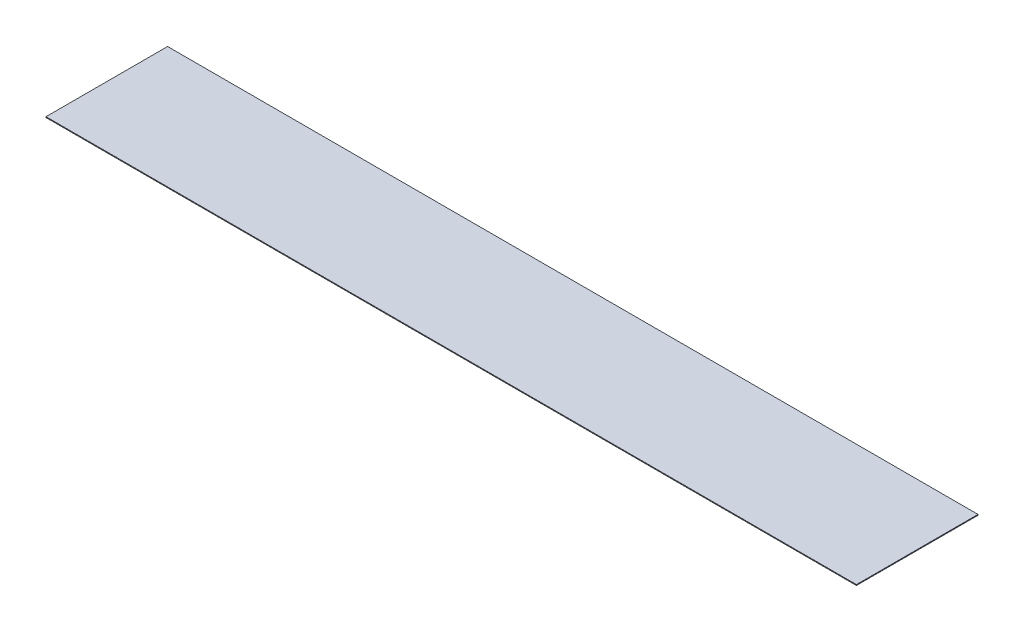
ISO-10303-21;
HEADER;
FILE_DESCRIPTION(('STEP AP214'),'2;1');
FILE_NAME('part.step','',(''),(''),'','','');
FILE_SCHEMA(('AUTOMOTIVE_DESIGN { 1 0 10303 214 1 1 1 1 }'));
ENDSEC;
DATA;
#1=APPLICATION_CONTEXT('core data for automotive mechanical design processes');
#2=APPLICATION_PROTOCOL_DEFINITION('international standard','automotive_design',2000,#1);
#3=PRODUCT_CONTEXT('',#1,'mechanical');
#4=PRODUCT('Part','Part','',(#3));
#5=PRODUCT_RELATED_PRODUCT_CATEGORY('part','',(#4));
#6=PRODUCT_DEFINITION_FORMATION('','',#4);
#7=PRODUCT_DEFINITION_CONTEXT('part definition',#1,'design');
#8=PRODUCT_DEFINITION('design','',#6,#7);
#9=PRODUCT_DEFINITION_SHAPE('','',#8);
#10=(LENGTH_UNIT() NAMED_UNIT(*) SI_UNIT(.MILLI.,.METRE.));
#11=(NAMED_UNIT(*) PLANE_ANGLE_UNIT() SI_UNIT($,.RADIAN.));
#12=(NAMED_UNIT(*) SI_UNIT($,.STERADIAN.) SOLID_ANGLE_UNIT());
#13=UNCERTAINTY_MEASURE_WITH_UNIT(LENGTH_MEASURE(1.E-05),#10,'distance_accuracy_value','');
#14=(GEOMETRIC_REPRESENTATION_CONTEXT(3) GLOBAL_UNCERTAINTY_ASSIGNED_CONTEXT((#13)) GLOBAL_UNIT_ASSIGNED_CONTEXT((#10,
#11,#12)) REPRESENTATION_CONTEXT('',''));
#15=CARTESIAN_POINT('',(0.,0.,0.));
#16=DIRECTION('',(0.,0.,1.));
#17=DIRECTION('',(1.,0.,0.));
#18=AXIS2_PLACEMENT_3D('',#15,#16,#17);
#19=CARTESIAN_POINT('',(500.,1.,75.));
#20=DIRECTION('',(-1.,0.,0.));
#21=DIRECTION('',(0.,0.,1.));
#22=AXIS2_PLACEMENT_3D('',#19,#20,#21);
#23=PLANE('',#22);
#24=DIRECTION('',(0.,0.,-1.));
#25=VECTOR('',#24,1.);
#26=CARTESIAN_POINT('',(500.,0.,75.));
#27=LINE('',#26,#25);
#28=CARTESIAN_POINT('',(500.,0.,75.));
#29=VERTEX_POINT('',#28);
#30=CARTESIAN_POINT('',(500.,0.,-75.));
#31=VERTEX_POINT('',#30);
#32=EDGE_CURVE('E107',#29,#31,#27,.T.);
#33=ORIENTED_EDGE('',*,*,#32,.T.);
#34=DIRECTION('',(0.,-1.,0.));
#35=VECTOR('',#34,1.);
#36=CARTESIAN_POINT('',(500.,1.,-75.));
#37=LINE('',#36,#35);
#38=CARTESIAN_POINT('',(500.,1.,-75.));
#39=VERTEX_POINT('',#38);
#40=EDGE_CURVE('E11',#39,#31,#37,.T.);
#41=ORIENTED_EDGE('',*,*,#40,.F.);
#42=DIRECTION('',(0.,0.,-1.));
#43=VECTOR('',#42,1.);
#44=CARTESIAN_POINT('',(500.,1.,75.));
#45=LINE('',#44,#43);
#46=CARTESIAN_POINT('',(500.,1.,75.));
#47=VERTEX_POINT('',#46);
#48=EDGE_CURVE('E91',#47,#39,#45,.T.);
#49=ORIENTED_EDGE('',*,*,#48,.F.);
#50=DIRECTION('',(0.,-1.,0.));
#51=VECTOR('',#50,1.);
#52=CARTESIAN_POINT('',(500.,1.,75.));
#53=LINE('',#52,#51);
#54=EDGE_CURVE('E103',#47,#29,#53,.T.);
#55=ORIENTED_EDGE('',*,*,#54,.T.);
#56=EDGE_LOOP('',(#33,#41,#49,#55));
#57=FACE_BOUND('',#56,.T.);
#58=ADVANCED_FACE('F39',(#57),#23,.F.);
#59=CARTESIAN_POINT('',(-500.,1.,-75.));
#60=DIRECTION('',(0.,0.,1.));
#61=DIRECTION('',(1.,0.,0.));
#62=AXIS2_PLACEMENT_3D('',#59,#60,#61);
#63=PLANE('',#62);
#64=DIRECTION('',(-1.,0.,0.));
#65=VECTOR('',#64,1.);
#66=CARTESIAN_POINT('',(-500.,0.,-75.));
#67=LINE('',#66,#65);
#68=CARTESIAN_POINT('',(-500.,0.,-75.));
#69=VERTEX_POINT('',#68);
#70=EDGE_CURVE('E96',#31,#69,#67,.T.);
#71=ORIENTED_EDGE('',*,*,#70,.T.);
#72=DIRECTION('',(0.,-1.,0.));
#73=VECTOR('',#72,1.);
#74=CARTESIAN_POINT('',(-500.,1.,-75.));
#75=LINE('',#74,#73);
#76=CARTESIAN_POINT('',(-500.,1.,-75.));
#77=VERTEX_POINT('',#76);
#78=EDGE_CURVE('E48',#77,#69,#75,.T.);
#79=ORIENTED_EDGE('',*,*,#78,.F.);
#80=DIRECTION('',(-1.,0.,0.));
#81=VECTOR('',#80,1.);
#82=CARTESIAN_POINT('',(-500.,1.,-75.));
#83=LINE('',#82,#81);
#84=EDGE_CURVE('E86',#39,#77,#83,.T.);
#85=ORIENTED_EDGE('',*,*,#84,.F.);
#86=ORIENTED_EDGE('',*,*,#40,.T.);
#87=EDGE_LOOP('',(#71,#79,#85,#86));
#88=FACE_BOUND('',#87,.T.);
#89=ADVANCED_FACE('F95',(#88),#63,.F.);
#90=CARTESIAN_POINT('',(-500.,1.,75.));
#91=DIRECTION('',(1.,0.,0.));
#92=DIRECTION('',(0.,0.,-1.));
#93=AXIS2_PLACEMENT_3D('',#90,#91,#92);
#94=PLANE('',#93);
#95=DIRECTION('',(0.,0.,1.));
#96=VECTOR('',#95,1.);
#97=CARTESIAN_POINT('',(-500.,0.,75.));
#98=LINE('',#97,#96);
#99=CARTESIAN_POINT('',(-500.,0.,75.));
#100=VERTEX_POINT('',#99);
#101=EDGE_CURVE('E73',#69,#100,#98,.T.);
#102=ORIENTED_EDGE('',*,*,#101,.T.);
#103=DIRECTION('',(0.,-1.,0.));
#104=VECTOR('',#103,1.);
#105=CARTESIAN_POINT('',(-500.,1.,75.));
#106=LINE('',#105,#104);
#107=CARTESIAN_POINT('',(-500.,1.,75.));
#108=VERTEX_POINT('',#107);
#109=EDGE_CURVE('E98',#108,#100,#106,.T.);
#110=ORIENTED_EDGE('',*,*,#109,.F.);
#111=DIRECTION('',(0.,0.,1.));
#112=VECTOR('',#111,1.);
#113=CARTESIAN_POINT('',(-500.,1.,75.));
#114=LINE('',#113,#112);
#115=EDGE_CURVE('E89',#77,#108,#114,.T.);
#116=ORIENTED_EDGE('',*,*,#115,.F.);
#117=ORIENTED_EDGE('',*,*,#78,.T.);
#118=EDGE_LOOP('',(#102,#110,#116,#117));
#119=FACE_BOUND('',#118,.T.);
#120=ADVANCED_FACE('F99',(#119),#94,.F.);
#121=CARTESIAN_POINT('',(-500.,1.,75.));
#122=DIRECTION('',(0.,0.,-1.));
#123=DIRECTION('',(-1.,0.,0.));
#124=AXIS2_PLACEMENT_3D('',#121,#122,#123);
#125=PLANE('',#124);
#126=DIRECTION('',(1.,0.,0.));
#127=VECTOR('',#126,1.);
#128=CARTESIAN_POINT('',(-500.,0.,75.));
#129=LINE('',#128,#127);
#130=EDGE_CURVE('E79',#100,#29,#129,.T.);
#131=ORIENTED_EDGE('',*,*,#130,.T.);
#132=ORIENTED_EDGE('',*,*,#54,.F.);
#133=DIRECTION('',(1.,0.,0.));
#134=VECTOR('',#133,1.);
#135=CARTESIAN_POINT('',(-500.,1.,75.));
#136=LINE('',#135,#134);
#137=EDGE_CURVE('E56',#108,#47,#136,.T.);
#138=ORIENTED_EDGE('',*,*,#137,.F.);
#139=ORIENTED_EDGE('',*,*,#109,.T.);
#140=EDGE_LOOP('',(#131,#132,#138,#139));
#141=FACE_BOUND('',#140,.T.);
#142=ADVANCED_FACE('F120',(#141),#125,.F.);
#143=CARTESIAN_POINT('',(0.,1.,0.));
#144=DIRECTION('',(0.,-1.,0.));
#145=DIRECTION('',(0.,0.,-1.));
#146=AXIS2_PLACEMENT_3D('',#143,#144,#145);
#147=PLANE('',#146);
#148=ORIENTED_EDGE('',*,*,#48,.T.);
#149=ORIENTED_EDGE('',*,*,#84,.T.);
#150=ORIENTED_EDGE('',*,*,#115,.T.);
#151=ORIENTED_EDGE('',*,*,#137,.T.);
#152=EDGE_LOOP('',(#148,#149,#150,#151));
#153=FACE_BOUND('',#152,.T.);
#154=ADVANCED_FACE('F87',(#153),#147,.F.);
#155=CARTESIAN_POINT('',(0.,0.,0.));
#156=DIRECTION('',(0.,-1.,0.));
#157=DIRECTION('',(0.,0.,-1.));
#158=AXIS2_PLACEMENT_3D('',#155,#156,#157);
#159=PLANE('',#158);
#160=ORIENTED_EDGE('',*,*,#32,.F.);
#161=ORIENTED_EDGE('',*,*,#130,.F.);
#162=ORIENTED_EDGE('',*,*,#101,.F.);
#163=ORIENTED_EDGE('',*,*,#70,.F.);
#164=EDGE_LOOP('',(#160,#161,#162,#163));
#165=FACE_BOUND('',#164,.T.);
#166=ADVANCED_FACE('F123',(#165),#159,.T.);
#167=CLOSED_SHELL('',(#58,#89,#120,#142,#154,#166));
#168=MANIFOLD_SOLID_BREP('B2',#167);
#169=ADVANCED_BREP_SHAPE_REPRESENTATION('',(#18,#168),#14);
#170=SHAPE_DEFINITION_REPRESENTATION(#9,#169);
ENDSEC;
END-ISO-10303-21;
